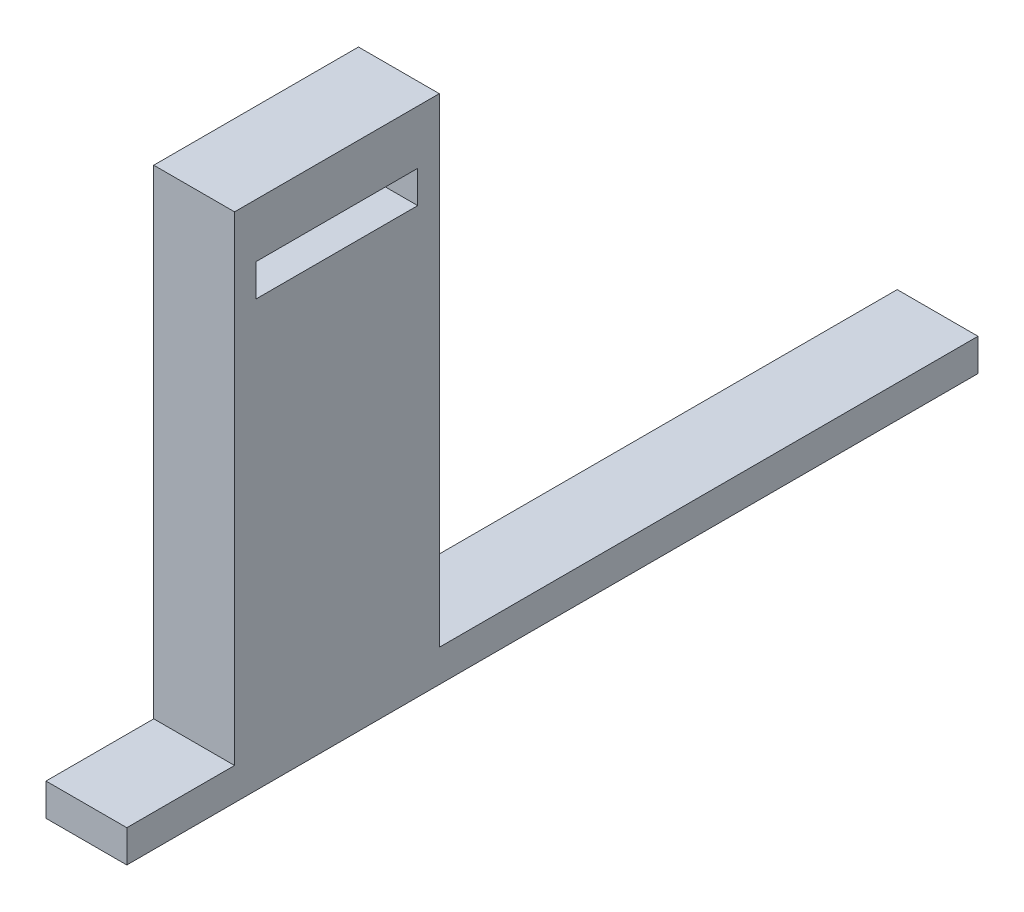
ISO-10303-21;
HEADER;
FILE_DESCRIPTION(('STEP AP214'),'2;1');
FILE_NAME('part.step','',(''),(''),'','','');
FILE_SCHEMA(('AUTOMOTIVE_DESIGN { 1 0 10303 214 1 1 1 1 }'));
ENDSEC;
DATA;
#1=APPLICATION_CONTEXT('core data for automotive mechanical design processes');
#2=APPLICATION_PROTOCOL_DEFINITION('international standard','automotive_design',2000,#1);
#3=PRODUCT_CONTEXT('',#1,'mechanical');
#4=PRODUCT('Part','Part','',(#3));
#5=PRODUCT_RELATED_PRODUCT_CATEGORY('part','',(#4));
#6=PRODUCT_DEFINITION_FORMATION('','',#4);
#7=PRODUCT_DEFINITION_CONTEXT('part definition',#1,'design');
#8=PRODUCT_DEFINITION('design','',#6,#7);
#9=PRODUCT_DEFINITION_SHAPE('','',#8);
#10=(LENGTH_UNIT() NAMED_UNIT(*) SI_UNIT(.MILLI.,.METRE.));
#11=(NAMED_UNIT(*) PLANE_ANGLE_UNIT() SI_UNIT($,.RADIAN.));
#12=(NAMED_UNIT(*) SI_UNIT($,.STERADIAN.) SOLID_ANGLE_UNIT());
#13=UNCERTAINTY_MEASURE_WITH_UNIT(LENGTH_MEASURE(1.E-05),#10,'distance_accuracy_value','');
#14=(GEOMETRIC_REPRESENTATION_CONTEXT(3) GLOBAL_UNCERTAINTY_ASSIGNED_CONTEXT((#13)) GLOBAL_UNIT_ASSIGNED_CONTEXT((#10,
#11,#12)) REPRESENTATION_CONTEXT('',''));
#15=CARTESIAN_POINT('',(0.,0.,0.));
#16=DIRECTION('',(0.,0.,1.));
#17=DIRECTION('',(1.,0.,0.));
#18=AXIS2_PLACEMENT_3D('',#15,#16,#17);
#19=CARTESIAN_POINT('',(15.,0.,0.));
#20=DIRECTION('',(1.,0.,0.));
#21=DIRECTION('',(0.,0.,-1.));
#22=AXIS2_PLACEMENT_3D('',#19,#20,#21);
#23=PLANE('',#22);
#24=DIRECTION('',(0.,1.,0.));
#25=VECTOR('',#24,1.);
#26=CARTESIAN_POINT('',(15.,6.00000000000003,-79.));
#27=LINE('',#26,#25);
#28=CARTESIAN_POINT('',(15.,0.,-79.));
#29=VERTEX_POINT('',#28);
#30=CARTESIAN_POINT('',(15.,6.00000000000003,-79.));
#31=VERTEX_POINT('',#30);
#32=EDGE_CURVE('E183',#29,#31,#27,.T.);
#33=ORIENTED_EDGE('',*,*,#32,.T.);
#34=DIRECTION('',(0.,0.,1.));
#35=VECTOR('',#34,1.);
#36=CARTESIAN_POINT('',(15.,6.,21.));
#37=LINE('',#36,#35);
#38=CARTESIAN_POINT('',(15.,6.,21.));
#39=VERTEX_POINT('',#38);
#40=EDGE_CURVE('E187',#31,#39,#37,.T.);
#41=ORIENTED_EDGE('',*,*,#40,.T.);
#42=DIRECTION('',(0.,1.,0.));
#43=VECTOR('',#42,1.);
#44=CARTESIAN_POINT('',(15.,95.,21.));
#45=LINE('',#44,#43);
#46=CARTESIAN_POINT('',(15.,95.,21.));
#47=VERTEX_POINT('',#46);
#48=EDGE_CURVE('E191',#39,#47,#45,.T.);
#49=ORIENTED_EDGE('',*,*,#48,.T.);
#50=DIRECTION('',(0.,0.,1.));
#51=VECTOR('',#50,1.);
#52=CARTESIAN_POINT('',(15.,95.,59.));
#53=LINE('',#52,#51);
#54=CARTESIAN_POINT('',(15.,95.,59.));
#55=VERTEX_POINT('',#54);
#56=EDGE_CURVE('E194',#47,#55,#53,.T.);
#57=ORIENTED_EDGE('',*,*,#56,.T.);
#58=DIRECTION('',(0.,-1.,0.));
#59=VECTOR('',#58,1.);
#60=CARTESIAN_POINT('',(15.,6.,59.));
#61=LINE('',#60,#59);
#62=CARTESIAN_POINT('',(15.,6.,59.));
#63=VERTEX_POINT('',#62);
#64=EDGE_CURVE('E197',#55,#63,#61,.T.);
#65=ORIENTED_EDGE('',*,*,#64,.T.);
#66=DIRECTION('',(0.,0.,1.));
#67=VECTOR('',#66,1.);
#68=CARTESIAN_POINT('',(15.,6.,79.));
#69=LINE('',#68,#67);
#70=CARTESIAN_POINT('',(15.,6.,79.));
#71=VERTEX_POINT('',#70);
#72=EDGE_CURVE('E200',#63,#71,#69,.T.);
#73=ORIENTED_EDGE('',*,*,#72,.T.);
#74=DIRECTION('',(0.,-1.,0.));
#75=VECTOR('',#74,1.);
#76=CARTESIAN_POINT('',(15.,0.,79.));
#77=LINE('',#76,#75);
#78=CARTESIAN_POINT('',(15.,0.,79.));
#79=VERTEX_POINT('',#78);
#80=EDGE_CURVE('E203',#71,#79,#77,.T.);
#81=ORIENTED_EDGE('',*,*,#80,.T.);
#82=DIRECTION('',(0.,0.,-1.));
#83=VECTOR('',#82,1.);
#84=CARTESIAN_POINT('',(15.,0.,79.));
#85=LINE('',#84,#83);
#86=EDGE_CURVE('E206',#79,#29,#85,.T.);
#87=ORIENTED_EDGE('',*,*,#86,.T.);
#88=EDGE_LOOP('',(#33,#41,#49,#57,#65,#73,#81,#87));
#89=FACE_BOUND('',#88,.T.);
#90=DIRECTION('',(0.,0.,-1.));
#91=VECTOR('',#90,1.);
#92=CARTESIAN_POINT('',(15.,79.,55.));
#93=LINE('',#92,#91);
#94=CARTESIAN_POINT('',(15.,79.,55.));
#95=VERTEX_POINT('',#94);
#96=CARTESIAN_POINT('',(15.,79.,25.));
#97=VERTEX_POINT('',#96);
#98=EDGE_CURVE('E144',#95,#97,#93,.T.);
#99=ORIENTED_EDGE('',*,*,#98,.F.);
#100=DIRECTION('',(0.,-1.,0.));
#101=VECTOR('',#100,1.);
#102=CARTESIAN_POINT('',(15.,85.,55.));
#103=LINE('',#102,#101);
#104=CARTESIAN_POINT('',(15.,85.,55.));
#105=VERTEX_POINT('',#104);
#106=EDGE_CURVE('E135',#105,#95,#103,.T.);
#107=ORIENTED_EDGE('',*,*,#106,.F.);
#108=DIRECTION('',(0.,0.,1.));
#109=VECTOR('',#108,1.);
#110=CARTESIAN_POINT('',(15.,85.,55.));
#111=LINE('',#110,#109);
#112=CARTESIAN_POINT('',(15.,85.,25.));
#113=VERTEX_POINT('',#112);
#114=EDGE_CURVE('E161',#113,#105,#111,.T.);
#115=ORIENTED_EDGE('',*,*,#114,.F.);
#116=DIRECTION('',(0.,1.,0.));
#117=VECTOR('',#116,1.);
#118=CARTESIAN_POINT('',(15.,85.,25.));
#119=LINE('',#118,#117);
#120=EDGE_CURVE('E157',#97,#113,#119,.T.);
#121=ORIENTED_EDGE('',*,*,#120,.F.);
#122=EDGE_LOOP('',(#99,#107,#115,#121));
#123=FACE_BOUND('',#122,.T.);
#124=ADVANCED_FACE('F45',(#89,#123),#23,.T.);
#125=CARTESIAN_POINT('',(0.,0.,0.));
#126=DIRECTION('',(1.,0.,0.));
#127=DIRECTION('',(0.,0.,-1.));
#128=AXIS2_PLACEMENT_3D('',#125,#126,#127);
#129=PLANE('',#128);
#130=DIRECTION('',(0.,1.,0.));
#131=VECTOR('',#130,1.);
#132=CARTESIAN_POINT('',(0.,6.00000000000003,-79.));
#133=LINE('',#132,#131);
#134=CARTESIAN_POINT('',(0.,0.,-79.));
#135=VERTEX_POINT('',#134);
#136=CARTESIAN_POINT('',(0.,6.00000000000003,-79.));
#137=VERTEX_POINT('',#136);
#138=EDGE_CURVE('E153',#135,#137,#133,.T.);
#139=ORIENTED_EDGE('',*,*,#138,.F.);
#140=DIRECTION('',(0.,0.,-1.));
#141=VECTOR('',#140,1.);
#142=CARTESIAN_POINT('',(0.,0.,79.));
#143=LINE('',#142,#141);
#144=CARTESIAN_POINT('',(0.,0.,79.));
#145=VERTEX_POINT('',#144);
#146=EDGE_CURVE('E188',#145,#135,#143,.T.);
#147=ORIENTED_EDGE('',*,*,#146,.F.);
#148=DIRECTION('',(0.,-1.,0.));
#149=VECTOR('',#148,1.);
#150=CARTESIAN_POINT('',(0.,0.,79.));
#151=LINE('',#150,#149);
#152=CARTESIAN_POINT('',(0.,6.,79.));
#153=VERTEX_POINT('',#152);
#154=EDGE_CURVE('E228',#153,#145,#151,.T.);
#155=ORIENTED_EDGE('',*,*,#154,.F.);
#156=DIRECTION('',(0.,0.,1.));
#157=VECTOR('',#156,1.);
#158=CARTESIAN_POINT('',(0.,6.,79.));
#159=LINE('',#158,#157);
#160=CARTESIAN_POINT('',(0.,6.,59.));
#161=VERTEX_POINT('',#160);
#162=EDGE_CURVE('E225',#161,#153,#159,.T.);
#163=ORIENTED_EDGE('',*,*,#162,.F.);
#164=DIRECTION('',(0.,-1.,0.));
#165=VECTOR('',#164,1.);
#166=CARTESIAN_POINT('',(0.,6.,59.));
#167=LINE('',#166,#165);
#168=CARTESIAN_POINT('',(0.,95.,59.));
#169=VERTEX_POINT('',#168);
#170=EDGE_CURVE('E222',#169,#161,#167,.T.);
#171=ORIENTED_EDGE('',*,*,#170,.F.);
#172=DIRECTION('',(0.,0.,1.));
#173=VECTOR('',#172,1.);
#174=CARTESIAN_POINT('',(0.,95.,59.));
#175=LINE('',#174,#173);
#176=CARTESIAN_POINT('',(0.,95.,21.));
#177=VERTEX_POINT('',#176);
#178=EDGE_CURVE('E219',#177,#169,#175,.T.);
#179=ORIENTED_EDGE('',*,*,#178,.F.);
#180=DIRECTION('',(0.,1.,0.));
#181=VECTOR('',#180,1.);
#182=CARTESIAN_POINT('',(0.,95.,21.));
#183=LINE('',#182,#181);
#184=CARTESIAN_POINT('',(0.,6.,21.));
#185=VERTEX_POINT('',#184);
#186=EDGE_CURVE('E216',#185,#177,#183,.T.);
#187=ORIENTED_EDGE('',*,*,#186,.F.);
#188=DIRECTION('',(0.,0.,1.));
#189=VECTOR('',#188,1.);
#190=CARTESIAN_POINT('',(0.,6.,21.));
#191=LINE('',#190,#189);
#192=EDGE_CURVE('E213',#137,#185,#191,.T.);
#193=ORIENTED_EDGE('',*,*,#192,.F.);
#194=EDGE_LOOP('',(#139,#147,#155,#163,#171,#179,#187,#193));
#195=FACE_BOUND('',#194,.T.);
#196=DIRECTION('',(0.,-1.,0.));
#197=VECTOR('',#196,1.);
#198=CARTESIAN_POINT('',(0.,85.,55.));
#199=LINE('',#198,#197);
#200=CARTESIAN_POINT('',(0.,85.,55.));
#201=VERTEX_POINT('',#200);
#202=CARTESIAN_POINT('',(0.,79.,55.));
#203=VERTEX_POINT('',#202);
#204=EDGE_CURVE('E69',#201,#203,#199,.T.);
#205=ORIENTED_EDGE('',*,*,#204,.T.);
#206=DIRECTION('',(0.,0.,-1.));
#207=VECTOR('',#206,1.);
#208=CARTESIAN_POINT('',(0.,79.,55.));
#209=LINE('',#208,#207);
#210=CARTESIAN_POINT('',(0.,79.,25.));
#211=VERTEX_POINT('',#210);
#212=EDGE_CURVE('E151',#203,#211,#209,.T.);
#213=ORIENTED_EDGE('',*,*,#212,.T.);
#214=DIRECTION('',(0.,1.,0.));
#215=VECTOR('',#214,1.);
#216=CARTESIAN_POINT('',(0.,85.,25.));
#217=LINE('',#216,#215);
#218=CARTESIAN_POINT('',(0.,85.,25.));
#219=VERTEX_POINT('',#218);
#220=EDGE_CURVE('E170',#211,#219,#217,.T.);
#221=ORIENTED_EDGE('',*,*,#220,.T.);
#222=DIRECTION('',(0.,0.,1.));
#223=VECTOR('',#222,1.);
#224=CARTESIAN_POINT('',(0.,85.,55.));
#225=LINE('',#224,#223);
#226=EDGE_CURVE('E145',#219,#201,#225,.T.);
#227=ORIENTED_EDGE('',*,*,#226,.T.);
#228=EDGE_LOOP('',(#205,#213,#221,#227));
#229=FACE_BOUND('',#228,.T.);
#230=ADVANCED_FACE('F267',(#195,#229),#129,.F.);
#231=CARTESIAN_POINT('',(15.,6.00000000000003,-79.));
#232=DIRECTION('',(0.,0.,1.));
#233=DIRECTION('',(1.,0.,0.));
#234=AXIS2_PLACEMENT_3D('',#231,#232,#233);
#235=PLANE('',#234);
#236=ORIENTED_EDGE('',*,*,#138,.T.);
#237=DIRECTION('',(-1.,0.,0.));
#238=VECTOR('',#237,1.);
#239=CARTESIAN_POINT('',(15.,6.00000000000003,-79.));
#240=LINE('',#239,#238);
#241=EDGE_CURVE('E11',#31,#137,#240,.T.);
#242=ORIENTED_EDGE('',*,*,#241,.F.);
#243=ORIENTED_EDGE('',*,*,#32,.F.);
#244=DIRECTION('',(-1.,0.,0.));
#245=VECTOR('',#244,1.);
#246=CARTESIAN_POINT('',(15.,0.,-79.));
#247=LINE('',#246,#245);
#248=EDGE_CURVE('E209',#29,#135,#247,.T.);
#249=ORIENTED_EDGE('',*,*,#248,.T.);
#250=EDGE_LOOP('',(#236,#242,#243,#249));
#251=FACE_BOUND('',#250,.T.);
#252=ADVANCED_FACE('F47',(#251),#235,.F.);
#253=CARTESIAN_POINT('',(15.,6.,21.));
#254=DIRECTION('',(0.,-1.,0.));
#255=DIRECTION('',(0.,0.,-1.));
#256=AXIS2_PLACEMENT_3D('',#253,#254,#255);
#257=PLANE('',#256);
#258=ORIENTED_EDGE('',*,*,#192,.T.);
#259=DIRECTION('',(-1.,0.,0.));
#260=VECTOR('',#259,1.);
#261=CARTESIAN_POINT('',(15.,6.,21.));
#262=LINE('',#261,#260);
#263=EDGE_CURVE('E54',#39,#185,#262,.T.);
#264=ORIENTED_EDGE('',*,*,#263,.F.);
#265=ORIENTED_EDGE('',*,*,#40,.F.);
#266=ORIENTED_EDGE('',*,*,#241,.T.);
#267=EDGE_LOOP('',(#258,#264,#265,#266));
#268=FACE_BOUND('',#267,.T.);
#269=ADVANCED_FACE('F284',(#268),#257,.F.);
#270=CARTESIAN_POINT('',(15.,95.,21.));
#271=DIRECTION('',(0.,0.,1.));
#272=DIRECTION('',(0.,-1.,0.));
#273=AXIS2_PLACEMENT_3D('',#270,#271,#272);
#274=PLANE('',#273);
#275=ORIENTED_EDGE('',*,*,#186,.T.);
#276=DIRECTION('',(-1.,0.,0.));
#277=VECTOR('',#276,1.);
#278=CARTESIAN_POINT('',(15.,95.,21.));
#279=LINE('',#278,#277);
#280=EDGE_CURVE('E252',#47,#177,#279,.T.);
#281=ORIENTED_EDGE('',*,*,#280,.F.);
#282=ORIENTED_EDGE('',*,*,#48,.F.);
#283=ORIENTED_EDGE('',*,*,#263,.T.);
#284=EDGE_LOOP('',(#275,#281,#282,#283));
#285=FACE_BOUND('',#284,.T.);
#286=ADVANCED_FACE('F261',(#285),#274,.F.);
#287=CARTESIAN_POINT('',(15.,95.,59.));
#288=DIRECTION('',(0.,-1.,0.));
#289=DIRECTION('',(0.,0.,-1.));
#290=AXIS2_PLACEMENT_3D('',#287,#288,#289);
#291=PLANE('',#290);
#292=ORIENTED_EDGE('',*,*,#178,.T.);
#293=DIRECTION('',(-1.,0.,0.));
#294=VECTOR('',#293,1.);
#295=CARTESIAN_POINT('',(15.,95.,59.));
#296=LINE('',#295,#294);
#297=EDGE_CURVE('E248',#55,#169,#296,.T.);
#298=ORIENTED_EDGE('',*,*,#297,.F.);
#299=ORIENTED_EDGE('',*,*,#56,.F.);
#300=ORIENTED_EDGE('',*,*,#280,.T.);
#301=EDGE_LOOP('',(#292,#298,#299,#300));
#302=FACE_BOUND('',#301,.T.);
#303=ADVANCED_FACE('F273',(#302),#291,.F.);
#304=CARTESIAN_POINT('',(15.,6.,59.));
#305=DIRECTION('',(0.,0.,-1.));
#306=DIRECTION('',(-1.,0.,0.));
#307=AXIS2_PLACEMENT_3D('',#304,#305,#306);
#308=PLANE('',#307);
#309=ORIENTED_EDGE('',*,*,#170,.T.);
#310=DIRECTION('',(-1.,0.,0.));
#311=VECTOR('',#310,1.);
#312=CARTESIAN_POINT('',(15.,6.,59.));
#313=LINE('',#312,#311);
#314=EDGE_CURVE('E244',#63,#161,#313,.T.);
#315=ORIENTED_EDGE('',*,*,#314,.F.);
#316=ORIENTED_EDGE('',*,*,#64,.F.);
#317=ORIENTED_EDGE('',*,*,#297,.T.);
#318=EDGE_LOOP('',(#309,#315,#316,#317));
#319=FACE_BOUND('',#318,.T.);
#320=ADVANCED_FACE('F277',(#319),#308,.F.);
#321=CARTESIAN_POINT('',(15.,6.,79.));
#322=DIRECTION('',(0.,-1.,0.));
#323=DIRECTION('',(0.,0.,-1.));
#324=AXIS2_PLACEMENT_3D('',#321,#322,#323);
#325=PLANE('',#324);
#326=ORIENTED_EDGE('',*,*,#162,.T.);
#327=DIRECTION('',(-1.,0.,0.));
#328=VECTOR('',#327,1.);
#329=CARTESIAN_POINT('',(15.,6.,79.));
#330=LINE('',#329,#328);
#331=EDGE_CURVE('E240',#71,#153,#330,.T.);
#332=ORIENTED_EDGE('',*,*,#331,.F.);
#333=ORIENTED_EDGE('',*,*,#72,.F.);
#334=ORIENTED_EDGE('',*,*,#314,.T.);
#335=EDGE_LOOP('',(#326,#332,#333,#334));
#336=FACE_BOUND('',#335,.T.);
#337=ADVANCED_FACE('F297',(#336),#325,.F.);
#338=CARTESIAN_POINT('',(15.,0.,79.));
#339=DIRECTION('',(0.,0.,-1.));
#340=DIRECTION('',(-1.,0.,0.));
#341=AXIS2_PLACEMENT_3D('',#338,#339,#340);
#342=PLANE('',#341);
#343=ORIENTED_EDGE('',*,*,#154,.T.);
#344=DIRECTION('',(-1.,0.,0.));
#345=VECTOR('',#344,1.);
#346=CARTESIAN_POINT('',(15.,0.,79.));
#347=LINE('',#346,#345);
#348=EDGE_CURVE('E236',#79,#145,#347,.T.);
#349=ORIENTED_EDGE('',*,*,#348,.F.);
#350=ORIENTED_EDGE('',*,*,#80,.F.);
#351=ORIENTED_EDGE('',*,*,#331,.T.);
#352=EDGE_LOOP('',(#343,#349,#350,#351));
#353=FACE_BOUND('',#352,.T.);
#354=ADVANCED_FACE('F295',(#353),#342,.F.);
#355=CARTESIAN_POINT('',(15.,0.,79.));
#356=DIRECTION('',(0.,1.,0.));
#357=DIRECTION('',(0.,0.,1.));
#358=AXIS2_PLACEMENT_3D('',#355,#356,#357);
#359=PLANE('',#358);
#360=ORIENTED_EDGE('',*,*,#146,.T.);
#361=ORIENTED_EDGE('',*,*,#248,.F.);
#362=ORIENTED_EDGE('',*,*,#86,.F.);
#363=ORIENTED_EDGE('',*,*,#348,.T.);
#364=EDGE_LOOP('',(#360,#361,#362,#363));
#365=FACE_BOUND('',#364,.T.);
#366=ADVANCED_FACE('F290',(#365),#359,.F.);
#367=CARTESIAN_POINT('',(15.,85.,55.));
#368=DIRECTION('',(0.,0.,-1.));
#369=DIRECTION('',(-1.,0.,0.));
#370=AXIS2_PLACEMENT_3D('',#367,#368,#369);
#371=PLANE('',#370);
#372=ORIENTED_EDGE('',*,*,#204,.F.);
#373=DIRECTION('',(-1.,0.,0.));
#374=VECTOR('',#373,1.);
#375=CARTESIAN_POINT('',(15.,85.,55.));
#376=LINE('',#375,#374);
#377=EDGE_CURVE('E139',#105,#201,#376,.T.);
#378=ORIENTED_EDGE('',*,*,#377,.F.);
#379=ORIENTED_EDGE('',*,*,#106,.T.);
#380=DIRECTION('',(-1.,0.,0.));
#381=VECTOR('',#380,1.);
#382=CARTESIAN_POINT('',(15.,79.,55.));
#383=LINE('',#382,#381);
#384=EDGE_CURVE('E138',#95,#203,#383,.T.);
#385=ORIENTED_EDGE('',*,*,#384,.T.);
#386=EDGE_LOOP('',(#372,#378,#379,#385));
#387=FACE_BOUND('',#386,.T.);
#388=ADVANCED_FACE('F137',(#387),#371,.T.);
#389=CARTESIAN_POINT('',(15.,79.,55.));
#390=DIRECTION('',(0.,1.,0.));
#391=DIRECTION('',(0.,0.,1.));
#392=AXIS2_PLACEMENT_3D('',#389,#390,#391);
#393=PLANE('',#392);
#394=ORIENTED_EDGE('',*,*,#212,.F.);
#395=ORIENTED_EDGE('',*,*,#384,.F.);
#396=ORIENTED_EDGE('',*,*,#98,.T.);
#397=DIRECTION('',(-1.,0.,0.));
#398=VECTOR('',#397,1.);
#399=CARTESIAN_POINT('',(15.,79.,25.));
#400=LINE('',#399,#398);
#401=EDGE_CURVE('E154',#97,#211,#400,.T.);
#402=ORIENTED_EDGE('',*,*,#401,.T.);
#403=EDGE_LOOP('',(#394,#395,#396,#402));
#404=FACE_BOUND('',#403,.T.);
#405=ADVANCED_FACE('F148',(#404),#393,.T.);
#406=CARTESIAN_POINT('',(15.,85.,25.));
#407=DIRECTION('',(0.,0.,1.));
#408=DIRECTION('',(1.,0.,0.));
#409=AXIS2_PLACEMENT_3D('',#406,#407,#408);
#410=PLANE('',#409);
#411=ORIENTED_EDGE('',*,*,#220,.F.);
#412=ORIENTED_EDGE('',*,*,#401,.F.);
#413=ORIENTED_EDGE('',*,*,#120,.T.);
#414=DIRECTION('',(-1.,0.,0.));
#415=VECTOR('',#414,1.);
#416=CARTESIAN_POINT('',(15.,85.,25.));
#417=LINE('',#416,#415);
#418=EDGE_CURVE('E61',#113,#219,#417,.T.);
#419=ORIENTED_EDGE('',*,*,#418,.T.);
#420=EDGE_LOOP('',(#411,#412,#413,#419));
#421=FACE_BOUND('',#420,.T.);
#422=ADVANCED_FACE('F322',(#421),#410,.T.);
#423=CARTESIAN_POINT('',(15.,85.,55.));
#424=DIRECTION('',(0.,-1.,0.));
#425=DIRECTION('',(0.,0.,-1.));
#426=AXIS2_PLACEMENT_3D('',#423,#424,#425);
#427=PLANE('',#426);
#428=ORIENTED_EDGE('',*,*,#226,.F.);
#429=ORIENTED_EDGE('',*,*,#418,.F.);
#430=ORIENTED_EDGE('',*,*,#114,.T.);
#431=ORIENTED_EDGE('',*,*,#377,.T.);
#432=EDGE_LOOP('',(#428,#429,#430,#431));
#433=FACE_BOUND('',#432,.T.);
#434=ADVANCED_FACE('F326',(#433),#427,.T.);
#435=CLOSED_SHELL('',(#124,#230,#252,#269,#286,#303,#320,#337,#354,#366,#388,#405,#422,#434));
#436=MANIFOLD_SOLID_BREP('B2',#435);
#437=ADVANCED_BREP_SHAPE_REPRESENTATION('',(#18,#436),#14);
#438=SHAPE_DEFINITION_REPRESENTATION(#9,#437);
ENDSEC;
END-ISO-10303-21;
